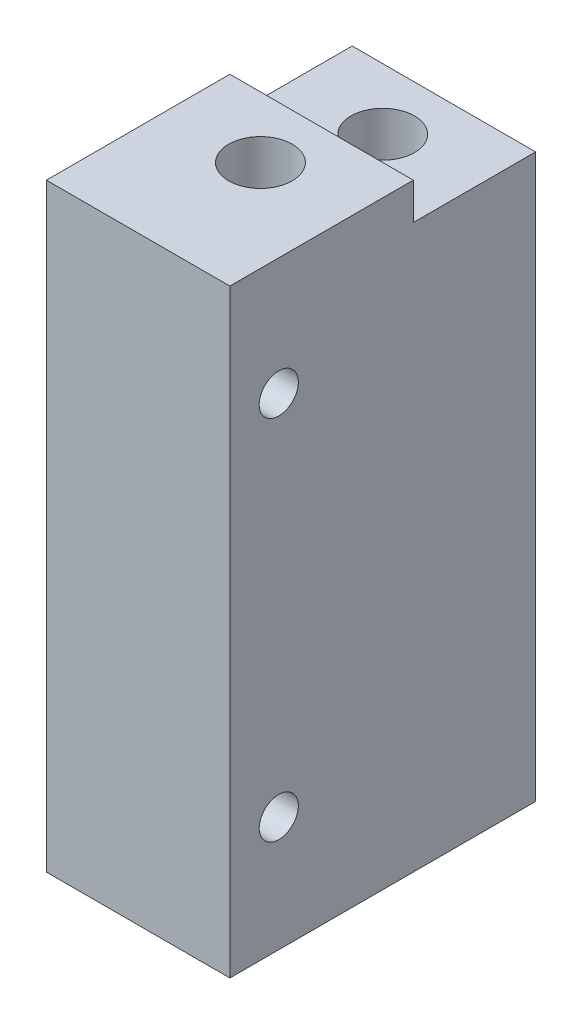
ISO-10303-21;
HEADER;
FILE_DESCRIPTION(('STEP AP214'),'2;1');
FILE_NAME('part.step','',(''),(''),'','','');
FILE_SCHEMA(('AUTOMOTIVE_DESIGN { 1 0 10303 214 1 1 1 1 }'));
ENDSEC;
DATA;
#1=APPLICATION_CONTEXT('core data for automotive mechanical design processes');
#2=APPLICATION_PROTOCOL_DEFINITION('international standard','automotive_design',2000,#1);
#3=PRODUCT_CONTEXT('',#1,'mechanical');
#4=PRODUCT('Part','Part','',(#3));
#5=PRODUCT_RELATED_PRODUCT_CATEGORY('part','',(#4));
#6=PRODUCT_DEFINITION_FORMATION('','',#4);
#7=PRODUCT_DEFINITION_CONTEXT('part definition',#1,'design');
#8=PRODUCT_DEFINITION('design','',#6,#7);
#9=PRODUCT_DEFINITION_SHAPE('','',#8);
#10=(LENGTH_UNIT() NAMED_UNIT(*) SI_UNIT(.MILLI.,.METRE.));
#11=(NAMED_UNIT(*) PLANE_ANGLE_UNIT() SI_UNIT($,.RADIAN.));
#12=(NAMED_UNIT(*) SI_UNIT($,.STERADIAN.) SOLID_ANGLE_UNIT());
#13=UNCERTAINTY_MEASURE_WITH_UNIT(LENGTH_MEASURE(1.E-05),#10,'distance_accuracy_value','');
#14=(GEOMETRIC_REPRESENTATION_CONTEXT(3) GLOBAL_UNCERTAINTY_ASSIGNED_CONTEXT((#13)) GLOBAL_UNIT_ASSIGNED_CONTEXT((#10,
#11,#12)) REPRESENTATION_CONTEXT('',''));
#15=CARTESIAN_POINT('',(0.,0.,0.));
#16=DIRECTION('',(0.,0.,1.));
#17=DIRECTION('',(1.,0.,0.));
#18=AXIS2_PLACEMENT_3D('',#15,#16,#17);
#19=CARTESIAN_POINT('',(15.,0.,0.));
#20=DIRECTION('',(1.,0.,0.));
#21=DIRECTION('',(0.,0.,-1.));
#22=AXIS2_PLACEMENT_3D('',#19,#20,#21);
#23=PLANE('',#22);
#24=CARTESIAN_POINT('',(15.,88.4,11.));
#25=DIRECTION('',(-1.,0.,0.));
#26=DIRECTION('',(0.,0.,-1.));
#27=AXIS2_PLACEMENT_3D('',#24,#25,#26);
#28=CIRCLE('',#27,1.6);
#29=CARTESIAN_POINT('',(15.,88.4,9.39999999999999));
#30=VERTEX_POINT('',#29);
#31=EDGE_CURVE('E167',#30,#30,#28,.T.);
#32=ORIENTED_EDGE('',*,*,#31,.T.);
#33=EDGE_LOOP('',(#32));
#34=FACE_BOUND('',#33,.T.);
#35=CARTESIAN_POINT('',(15.,58.4,11.));
#36=DIRECTION('',(-1.,0.,0.));
#37=DIRECTION('',(0.,0.,-1.));
#38=AXIS2_PLACEMENT_3D('',#35,#36,#37);
#39=CIRCLE('',#38,1.6);
#40=CARTESIAN_POINT('',(15.,58.4,9.4));
#41=VERTEX_POINT('',#40);
#42=EDGE_CURVE('E175',#41,#41,#39,.T.);
#43=ORIENTED_EDGE('',*,*,#42,.T.);
#44=EDGE_LOOP('',(#43));
#45=FACE_BOUND('',#44,.T.);
#46=DIRECTION('',(0.,-1.,0.));
#47=VECTOR('',#46,1.);
#48=CARTESIAN_POINT('',(15.,0.,15.));
#49=LINE('',#48,#47);
#50=CARTESIAN_POINT('',(15.,98.,15.));
#51=VERTEX_POINT('',#50);
#52=CARTESIAN_POINT('',(15.,49.,15.));
#53=VERTEX_POINT('',#52);
#54=EDGE_CURVE('E11',#51,#53,#49,.T.);
#55=ORIENTED_EDGE('',*,*,#54,.T.);
#56=DIRECTION('',(0.,0.,1.));
#57=VECTOR('',#56,1.);
#58=CARTESIAN_POINT('',(15.,49.,15.));
#59=LINE('',#58,#57);
#60=CARTESIAN_POINT('',(15.,49.,-9.99999999999999));
#61=VERTEX_POINT('',#60);
#62=EDGE_CURVE('E100',#61,#53,#59,.T.);
#63=ORIENTED_EDGE('',*,*,#62,.F.);
#64=DIRECTION('',(0.,-1.,0.));
#65=VECTOR('',#64,1.);
#66=CARTESIAN_POINT('',(15.,49.,-10.));
#67=LINE('',#66,#65);
#68=CARTESIAN_POINT('',(15.,95.,-10.));
#69=VERTEX_POINT('',#68);
#70=EDGE_CURVE('E107',#69,#61,#67,.T.);
#71=ORIENTED_EDGE('',*,*,#70,.F.);
#72=DIRECTION('',(0.,0.,1.));
#73=VECTOR('',#72,1.);
#74=CARTESIAN_POINT('',(15.,95.,-10.));
#75=LINE('',#74,#73);
#76=CARTESIAN_POINT('',(15.,95.,0.));
#77=VERTEX_POINT('',#76);
#78=EDGE_CURVE('E68',#69,#77,#75,.T.);
#79=ORIENTED_EDGE('',*,*,#78,.T.);
#80=DIRECTION('',(0.,-1.,0.));
#81=VECTOR('',#80,1.);
#82=CARTESIAN_POINT('',(15.,98.,0.));
#83=LINE('',#82,#81);
#84=CARTESIAN_POINT('',(15.,98.,0.));
#85=VERTEX_POINT('',#84);
#86=EDGE_CURVE('E183',#85,#77,#83,.T.);
#87=ORIENTED_EDGE('',*,*,#86,.F.);
#88=DIRECTION('',(0.,0.,-1.));
#89=VECTOR('',#88,1.);
#90=CARTESIAN_POINT('',(15.,98.,0.));
#91=LINE('',#90,#89);
#92=EDGE_CURVE('E186',#51,#85,#91,.T.);
#93=ORIENTED_EDGE('',*,*,#92,.F.);
#94=EDGE_LOOP('',(#55,#63,#71,#79,#87,#93));
#95=FACE_BOUND('',#94,.T.);
#96=ADVANCED_FACE('F42',(#34,#45,#95),#23,.T.);
#97=CARTESIAN_POINT('',(0.,0.,0.));
#98=DIRECTION('',(1.,0.,0.));
#99=DIRECTION('',(0.,0.,-1.));
#100=AXIS2_PLACEMENT_3D('',#97,#98,#99);
#101=PLANE('',#100);
#102=CARTESIAN_POINT('',(0.,88.4,11.));
#103=DIRECTION('',(-1.,0.,0.));
#104=DIRECTION('',(0.,0.,-1.));
#105=AXIS2_PLACEMENT_3D('',#102,#103,#104);
#106=CIRCLE('',#105,1.6);
#107=CARTESIAN_POINT('',(0.,88.4,9.39999999999999));
#108=VERTEX_POINT('',#107);
#109=EDGE_CURVE('E166',#108,#108,#106,.T.);
#110=ORIENTED_EDGE('',*,*,#109,.F.);
#111=EDGE_LOOP('',(#110));
#112=FACE_BOUND('',#111,.T.);
#113=CARTESIAN_POINT('',(0.,58.4,11.));
#114=DIRECTION('',(-1.,0.,0.));
#115=DIRECTION('',(0.,0.,-1.));
#116=AXIS2_PLACEMENT_3D('',#113,#114,#115);
#117=CIRCLE('',#116,1.6);
#118=CARTESIAN_POINT('',(0.,58.4,9.4));
#119=VERTEX_POINT('',#118);
#120=EDGE_CURVE('E171',#119,#119,#117,.T.);
#121=ORIENTED_EDGE('',*,*,#120,.F.);
#122=EDGE_LOOP('',(#121));
#123=FACE_BOUND('',#122,.T.);
#124=DIRECTION('',(0.,0.,-1.));
#125=VECTOR('',#124,1.);
#126=CARTESIAN_POINT('',(0.,49.,15.));
#127=LINE('',#126,#125);
#128=CARTESIAN_POINT('',(0.,49.,15.));
#129=VERTEX_POINT('',#128);
#130=CARTESIAN_POINT('',(0.,49.,-10.));
#131=VERTEX_POINT('',#130);
#132=EDGE_CURVE('E60',#129,#131,#127,.T.);
#133=ORIENTED_EDGE('',*,*,#132,.F.);
#134=DIRECTION('',(0.,-1.,0.));
#135=VECTOR('',#134,1.);
#136=CARTESIAN_POINT('',(0.,0.,15.));
#137=LINE('',#136,#135);
#138=CARTESIAN_POINT('',(0.,98.,15.));
#139=VERTEX_POINT('',#138);
#140=EDGE_CURVE('E52',#139,#129,#137,.T.);
#141=ORIENTED_EDGE('',*,*,#140,.F.);
#142=DIRECTION('',(0.,0.,-1.));
#143=VECTOR('',#142,1.);
#144=CARTESIAN_POINT('',(0.,98.,0.));
#145=LINE('',#144,#143);
#146=CARTESIAN_POINT('',(0.,98.,0.));
#147=VERTEX_POINT('',#146);
#148=EDGE_CURVE('E135',#139,#147,#145,.T.);
#149=ORIENTED_EDGE('',*,*,#148,.T.);
#150=DIRECTION('',(0.,-1.,0.));
#151=VECTOR('',#150,1.);
#152=CARTESIAN_POINT('',(0.,98.,0.));
#153=LINE('',#152,#151);
#154=CARTESIAN_POINT('',(0.,95.,0.));
#155=VERTEX_POINT('',#154);
#156=EDGE_CURVE('E179',#147,#155,#153,.T.);
#157=ORIENTED_EDGE('',*,*,#156,.T.);
#158=DIRECTION('',(0.,0.,1.));
#159=VECTOR('',#158,1.);
#160=CARTESIAN_POINT('',(0.,95.,-10.));
#161=LINE('',#160,#159);
#162=CARTESIAN_POINT('',(0.,95.,-10.));
#163=VERTEX_POINT('',#162);
#164=EDGE_CURVE('E154',#163,#155,#161,.T.);
#165=ORIENTED_EDGE('',*,*,#164,.F.);
#166=DIRECTION('',(0.,1.,0.));
#167=VECTOR('',#166,1.);
#168=CARTESIAN_POINT('',(0.,49.,-10.));
#169=LINE('',#168,#167);
#170=EDGE_CURVE('E117',#131,#163,#169,.T.);
#171=ORIENTED_EDGE('',*,*,#170,.F.);
#172=EDGE_LOOP('',(#133,#141,#149,#157,#165,#171));
#173=FACE_BOUND('',#172,.T.);
#174=ADVANCED_FACE('F133',(#112,#123,#173),#101,.F.);
#175=CARTESIAN_POINT('',(15.,0.,15.));
#176=DIRECTION('',(0.,0.,-1.));
#177=DIRECTION('',(-1.,0.,0.));
#178=AXIS2_PLACEMENT_3D('',#175,#176,#177);
#179=PLANE('',#178);
#180=DIRECTION('',(-1.,0.,0.));
#181=VECTOR('',#180,1.);
#182=CARTESIAN_POINT('',(0.,49.,15.));
#183=LINE('',#182,#181);
#184=EDGE_CURVE('E111',#53,#129,#183,.T.);
#185=ORIENTED_EDGE('',*,*,#184,.F.);
#186=ORIENTED_EDGE('',*,*,#54,.F.);
#187=DIRECTION('',(-1.,0.,0.));
#188=VECTOR('',#187,1.);
#189=CARTESIAN_POINT('',(15.,98.,15.));
#190=LINE('',#189,#188);
#191=EDGE_CURVE('E118',#51,#139,#190,.T.);
#192=ORIENTED_EDGE('',*,*,#191,.T.);
#193=ORIENTED_EDGE('',*,*,#140,.T.);
#194=EDGE_LOOP('',(#185,#186,#192,#193));
#195=FACE_BOUND('',#194,.T.);
#196=ADVANCED_FACE('F44',(#195),#179,.F.);
#197=CARTESIAN_POINT('',(7.5,49.,5.00000000000001));
#198=DIRECTION('',(0.,-1.,0.));
#199=DIRECTION('',(0.,0.,-1.));
#200=AXIS2_PLACEMENT_3D('',#197,#198,#199);
#201=CYLINDRICAL_SURFACE('',#200,2.6);
#202=CARTESIAN_POINT('',(7.5,98.,5.));
#203=DIRECTION('',(0.,-1.,0.));
#204=DIRECTION('',(0.,0.,-1.));
#205=AXIS2_PLACEMENT_3D('',#202,#203,#204);
#206=CIRCLE('',#205,2.6);
#207=CARTESIAN_POINT('',(7.5,98.,2.4));
#208=VERTEX_POINT('',#207);
#209=EDGE_CURVE('E162',#208,#208,#206,.T.);
#210=ORIENTED_EDGE('',*,*,#209,.F.);
#211=EDGE_LOOP('',(#210));
#212=FACE_BOUND('',#211,.T.);
#213=CARTESIAN_POINT('',(7.5,49.,5.00000000000001));
#214=DIRECTION('',(0.,-1.,0.));
#215=DIRECTION('',(0.,0.,-1.));
#216=AXIS2_PLACEMENT_3D('',#213,#214,#215);
#217=CIRCLE('',#216,2.6);
#218=CARTESIAN_POINT('',(7.5,49.,2.40000000000001));
#219=VERTEX_POINT('',#218);
#220=EDGE_CURVE('E143',#219,#219,#217,.F.);
#221=ORIENTED_EDGE('',*,*,#220,.F.);
#222=EDGE_LOOP('',(#221));
#223=FACE_BOUND('',#222,.T.);
#224=ADVANCED_FACE('F223',(#212,#223),#201,.F.);
#225=CARTESIAN_POINT('',(0.,0.,-10.));
#226=DIRECTION('',(0.,0.,-1.));
#227=DIRECTION('',(0.,1.,0.));
#228=AXIS2_PLACEMENT_3D('',#225,#226,#227);
#229=PLANE('',#228);
#230=ORIENTED_EDGE('',*,*,#70,.T.);
#231=DIRECTION('',(1.,0.,0.));
#232=VECTOR('',#231,1.);
#233=CARTESIAN_POINT('',(0.,49.,-9.99999999999999));
#234=LINE('',#233,#232);
#235=EDGE_CURVE('E96',#131,#61,#234,.T.);
#236=ORIENTED_EDGE('',*,*,#235,.F.);
#237=ORIENTED_EDGE('',*,*,#170,.T.);
#238=DIRECTION('',(-1.,0.,0.));
#239=VECTOR('',#238,1.);
#240=CARTESIAN_POINT('',(15.,95.,-10.));
#241=LINE('',#240,#239);
#242=EDGE_CURVE('E115',#69,#163,#241,.T.);
#243=ORIENTED_EDGE('',*,*,#242,.F.);
#244=EDGE_LOOP('',(#230,#236,#237,#243));
#245=FACE_BOUND('',#244,.T.);
#246=ADVANCED_FACE('F113',(#245),#229,.T.);
#247=CARTESIAN_POINT('',(7.5,49.,-5.));
#248=DIRECTION('',(0.,-1.,0.));
#249=DIRECTION('',(0.,0.,-1.));
#250=AXIS2_PLACEMENT_3D('',#247,#248,#249);
#251=CYLINDRICAL_SURFACE('',#250,2.6);
#252=CARTESIAN_POINT('',(7.5,95.,-5.));
#253=DIRECTION('',(0.,-1.,0.));
#254=DIRECTION('',(0.,0.,-1.));
#255=AXIS2_PLACEMENT_3D('',#252,#253,#254);
#256=CIRCLE('',#255,2.6);
#257=CARTESIAN_POINT('',(7.5,95.,-7.6));
#258=VERTEX_POINT('',#257);
#259=EDGE_CURVE('E147',#258,#258,#256,.T.);
#260=ORIENTED_EDGE('',*,*,#259,.F.);
#261=EDGE_LOOP('',(#260));
#262=FACE_BOUND('',#261,.T.);
#263=CARTESIAN_POINT('',(7.5,49.,-5.));
#264=DIRECTION('',(0.,-1.,0.));
#265=DIRECTION('',(0.,0.,-1.));
#266=AXIS2_PLACEMENT_3D('',#263,#264,#265);
#267=CIRCLE('',#266,2.6);
#268=CARTESIAN_POINT('',(7.5,49.,-7.6));
#269=VERTEX_POINT('',#268);
#270=EDGE_CURVE('E46',#269,#269,#267,.F.);
#271=ORIENTED_EDGE('',*,*,#270,.F.);
#272=EDGE_LOOP('',(#271));
#273=FACE_BOUND('',#272,.T.);
#274=ADVANCED_FACE('F229',(#262,#273),#251,.F.);
#275=CARTESIAN_POINT('',(15.,98.,0.));
#276=DIRECTION('',(0.,0.,1.));
#277=DIRECTION('',(0.,1.,0.));
#278=AXIS2_PLACEMENT_3D('',#275,#276,#277);
#279=PLANE('',#278);
#280=DIRECTION('',(-1.,0.,0.));
#281=VECTOR('',#280,1.);
#282=CARTESIAN_POINT('',(15.,95.,0.));
#283=LINE('',#282,#281);
#284=EDGE_CURVE('E151',#77,#155,#283,.T.);
#285=ORIENTED_EDGE('',*,*,#284,.T.);
#286=ORIENTED_EDGE('',*,*,#156,.F.);
#287=DIRECTION('',(-1.,0.,0.));
#288=VECTOR('',#287,1.);
#289=CARTESIAN_POINT('',(15.,98.,0.));
#290=LINE('',#289,#288);
#291=EDGE_CURVE('E124',#85,#147,#290,.T.);
#292=ORIENTED_EDGE('',*,*,#291,.F.);
#293=ORIENTED_EDGE('',*,*,#86,.T.);
#294=EDGE_LOOP('',(#285,#286,#292,#293));
#295=FACE_BOUND('',#294,.T.);
#296=ADVANCED_FACE('F198',(#295),#279,.F.);
#297=CARTESIAN_POINT('',(15.,98.,0.));
#298=DIRECTION('',(0.,-1.,0.));
#299=DIRECTION('',(0.,0.,1.));
#300=AXIS2_PLACEMENT_3D('',#297,#298,#299);
#301=PLANE('',#300);
#302=ORIENTED_EDGE('',*,*,#209,.T.);
#303=EDGE_LOOP('',(#302));
#304=FACE_BOUND('',#303,.T.);
#305=ORIENTED_EDGE('',*,*,#148,.F.);
#306=ORIENTED_EDGE('',*,*,#191,.F.);
#307=ORIENTED_EDGE('',*,*,#92,.T.);
#308=ORIENTED_EDGE('',*,*,#291,.T.);
#309=EDGE_LOOP('',(#305,#306,#307,#308));
#310=FACE_BOUND('',#309,.T.);
#311=ADVANCED_FACE('F196',(#304,#310),#301,.F.);
#312=CARTESIAN_POINT('',(15.,58.4,11.));
#313=DIRECTION('',(-1.,0.,0.));
#314=DIRECTION('',(0.,0.,1.));
#315=AXIS2_PLACEMENT_3D('',#312,#313,#314);
#316=CYLINDRICAL_SURFACE('',#315,1.6);
#317=ORIENTED_EDGE('',*,*,#42,.F.);
#318=EDGE_LOOP('',(#317));
#319=FACE_BOUND('',#318,.T.);
#320=ORIENTED_EDGE('',*,*,#120,.T.);
#321=EDGE_LOOP('',(#320));
#322=FACE_BOUND('',#321,.T.);
#323=ADVANCED_FACE('F212',(#319,#322),#316,.F.);
#324=CARTESIAN_POINT('',(15.,88.4,11.));
#325=DIRECTION('',(-1.,0.,0.));
#326=DIRECTION('',(0.,0.,1.));
#327=AXIS2_PLACEMENT_3D('',#324,#325,#326);
#328=CYLINDRICAL_SURFACE('',#327,1.6);
#329=ORIENTED_EDGE('',*,*,#31,.F.);
#330=EDGE_LOOP('',(#329));
#331=FACE_BOUND('',#330,.T.);
#332=ORIENTED_EDGE('',*,*,#109,.T.);
#333=EDGE_LOOP('',(#332));
#334=FACE_BOUND('',#333,.T.);
#335=ADVANCED_FACE('F203',(#331,#334),#328,.F.);
#336=CARTESIAN_POINT('',(15.,95.,-10.));
#337=DIRECTION('',(0.,-1.,0.));
#338=DIRECTION('',(0.,0.,1.));
#339=AXIS2_PLACEMENT_3D('',#336,#337,#338);
#340=PLANE('',#339);
#341=ORIENTED_EDGE('',*,*,#259,.T.);
#342=EDGE_LOOP('',(#341));
#343=FACE_BOUND('',#342,.T.);
#344=ORIENTED_EDGE('',*,*,#284,.F.);
#345=ORIENTED_EDGE('',*,*,#78,.F.);
#346=ORIENTED_EDGE('',*,*,#242,.T.);
#347=ORIENTED_EDGE('',*,*,#164,.T.);
#348=EDGE_LOOP('',(#344,#345,#346,#347));
#349=FACE_BOUND('',#348,.T.);
#350=ADVANCED_FACE('F201',(#343,#349),#340,.F.);
#351=CARTESIAN_POINT('',(0.,49.,0.));
#352=DIRECTION('',(0.,-1.,0.));
#353=DIRECTION('',(0.,0.,-1.));
#354=AXIS2_PLACEMENT_3D('',#351,#352,#353);
#355=PLANE('',#354);
#356=ORIENTED_EDGE('',*,*,#132,.T.);
#357=ORIENTED_EDGE('',*,*,#235,.T.);
#358=ORIENTED_EDGE('',*,*,#62,.T.);
#359=ORIENTED_EDGE('',*,*,#184,.T.);
#360=EDGE_LOOP('',(#356,#357,#358,#359));
#361=FACE_BOUND('',#360,.T.);
#362=ORIENTED_EDGE('',*,*,#270,.T.);
#363=EDGE_LOOP('',(#362));
#364=FACE_BOUND('',#363,.T.);
#365=ORIENTED_EDGE('',*,*,#220,.T.);
#366=EDGE_LOOP('',(#365));
#367=FACE_BOUND('',#366,.T.);
#368=ADVANCED_FACE('F98',(#361,#364,#367),#355,.T.);
#369=CLOSED_SHELL('',(#96,#174,#196,#224,#246,#274,#296,#311,#323,#335,#350,#368));
#370=MANIFOLD_SOLID_BREP('B2',#369);
#371=ADVANCED_BREP_SHAPE_REPRESENTATION('',(#18,#370),#14);
#372=SHAPE_DEFINITION_REPRESENTATION(#9,#371);
ENDSEC;
END-ISO-10303-21;
